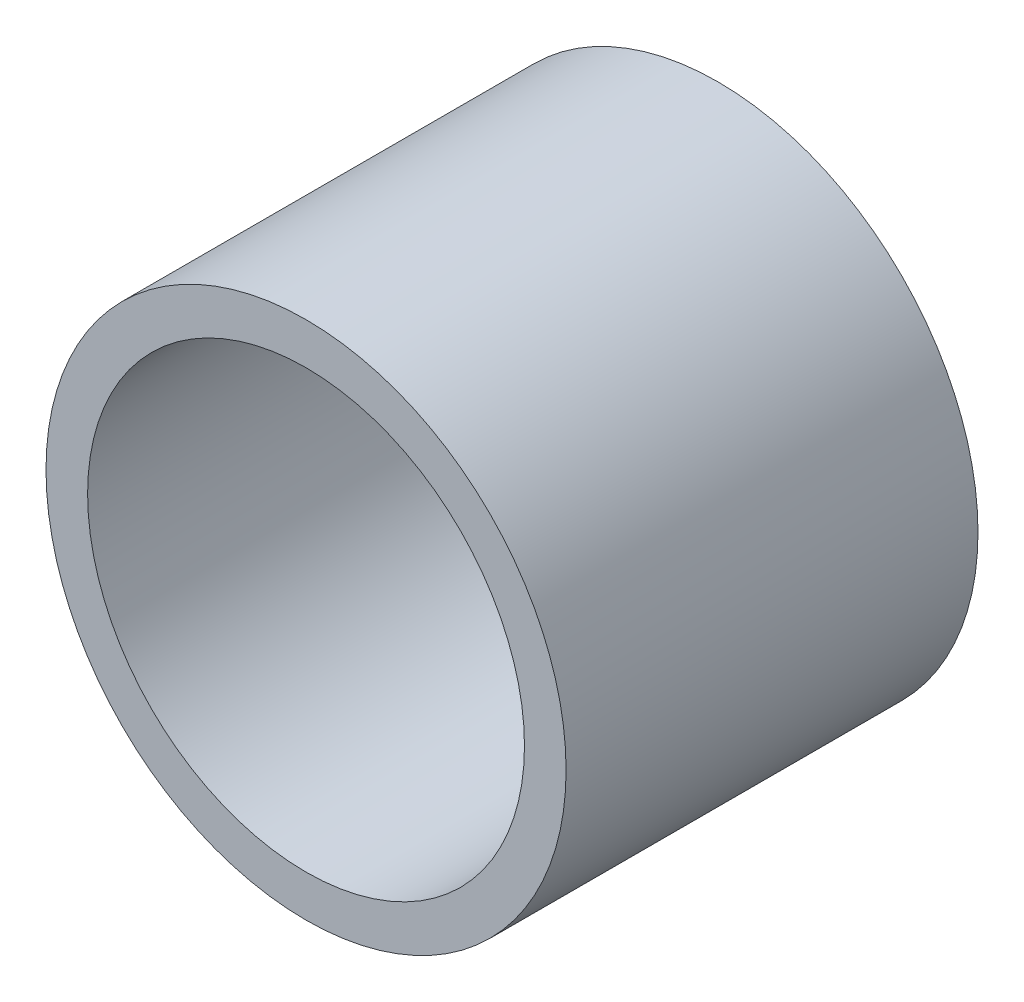
ISO-10303-21;
HEADER;
FILE_DESCRIPTION(('STEP AP214'),'2;1');
FILE_NAME('part.step','',(''),(''),'','','');
FILE_SCHEMA(('AUTOMOTIVE_DESIGN { 1 0 10303 214 1 1 1 1 }'));
ENDSEC;
DATA;
#1=APPLICATION_CONTEXT('core data for automotive mechanical design processes');
#2=APPLICATION_PROTOCOL_DEFINITION('international standard','automotive_design',2000,#1);
#3=PRODUCT_CONTEXT('',#1,'mechanical');
#4=PRODUCT('Part','Part','',(#3));
#5=PRODUCT_RELATED_PRODUCT_CATEGORY('part','',(#4));
#6=PRODUCT_DEFINITION_FORMATION('','',#4);
#7=PRODUCT_DEFINITION_CONTEXT('part definition',#1,'design');
#8=PRODUCT_DEFINITION('design','',#6,#7);
#9=PRODUCT_DEFINITION_SHAPE('','',#8);
#10=(LENGTH_UNIT() NAMED_UNIT(*) SI_UNIT(.MILLI.,.METRE.));
#11=(NAMED_UNIT(*) PLANE_ANGLE_UNIT() SI_UNIT($,.RADIAN.));
#12=(NAMED_UNIT(*) SI_UNIT($,.STERADIAN.) SOLID_ANGLE_UNIT());
#13=UNCERTAINTY_MEASURE_WITH_UNIT(LENGTH_MEASURE(1.E-05),#10,'distance_accuracy_value','');
#14=(GEOMETRIC_REPRESENTATION_CONTEXT(3) GLOBAL_UNCERTAINTY_ASSIGNED_CONTEXT((#13)) GLOBAL_UNIT_ASSIGNED_CONTEXT((#10,
#11,#12)) REPRESENTATION_CONTEXT('',''));
#15=CARTESIAN_POINT('',(0.,0.,0.));
#16=DIRECTION('',(0.,0.,1.));
#17=DIRECTION('',(1.,0.,0.));
#18=AXIS2_PLACEMENT_3D('',#15,#16,#17);
#19=CARTESIAN_POINT('',(0.,0.,19.8));
#20=DIRECTION('',(0.,0.,1.));
#21=DIRECTION('',(1.,0.,0.));
#22=AXIS2_PLACEMENT_3D('',#19,#20,#21);
#23=PLANE('',#22);
#24=CARTESIAN_POINT('',(0.,0.,19.8));
#25=DIRECTION('',(0.,0.,1.));
#26=DIRECTION('',(1.,0.,0.));
#27=AXIS2_PLACEMENT_3D('',#24,#25,#26);
#28=CIRCLE('',#27,12.5);
#29=CARTESIAN_POINT('',(-12.5,0.,19.8));
#30=VERTEX_POINT('',#29);
#31=EDGE_CURVE('E10',#30,#30,#28,.T.);
#32=ORIENTED_EDGE('',*,*,#31,.T.);
#33=EDGE_LOOP('',(#32));
#34=FACE_BOUND('',#33,.T.);
#35=CARTESIAN_POINT('',(0.,0.,19.8));
#36=DIRECTION('',(0.,0.,1.));
#37=DIRECTION('',(1.,0.,0.));
#38=AXIS2_PLACEMENT_3D('',#35,#36,#37);
#39=CIRCLE('',#38,10.5);
#40=CARTESIAN_POINT('',(-10.5,0.,19.8));
#41=VERTEX_POINT('',#40);
#42=EDGE_CURVE('E50',#41,#41,#39,.T.);
#43=ORIENTED_EDGE('',*,*,#42,.F.);
#44=EDGE_LOOP('',(#43));
#45=FACE_BOUND('',#44,.T.);
#46=ADVANCED_FACE('F37',(#34,#45),#23,.T.);
#47=CARTESIAN_POINT('',(0.,0.,0.));
#48=DIRECTION('',(0.,0.,1.));
#49=DIRECTION('',(1.,0.,0.));
#50=AXIS2_PLACEMENT_3D('',#47,#48,#49);
#51=PLANE('',#50);
#52=CARTESIAN_POINT('',(0.,0.,0.));
#53=DIRECTION('',(0.,0.,1.));
#54=DIRECTION('',(1.,0.,0.));
#55=AXIS2_PLACEMENT_3D('',#52,#53,#54);
#56=CIRCLE('',#55,12.5);
#57=CARTESIAN_POINT('',(-12.5,0.,0.));
#58=VERTEX_POINT('',#57);
#59=EDGE_CURVE('E41',#58,#58,#56,.T.);
#60=ORIENTED_EDGE('',*,*,#59,.F.);
#61=EDGE_LOOP('',(#60));
#62=FACE_BOUND('',#61,.T.);
#63=CARTESIAN_POINT('',(0.,0.,0.));
#64=DIRECTION('',(0.,0.,1.));
#65=DIRECTION('',(1.,0.,0.));
#66=AXIS2_PLACEMENT_3D('',#63,#64,#65);
#67=CIRCLE('',#66,10.5);
#68=CARTESIAN_POINT('',(-10.5,0.,0.));
#69=VERTEX_POINT('',#68);
#70=EDGE_CURVE('E52',#69,#69,#67,.T.);
#71=ORIENTED_EDGE('',*,*,#70,.T.);
#72=EDGE_LOOP('',(#71));
#73=FACE_BOUND('',#72,.T.);
#74=ADVANCED_FACE('F64',(#62,#73),#51,.F.);
#75=CARTESIAN_POINT('',(0.,0.,19.8));
#76=DIRECTION('',(0.,0.,-1.));
#77=DIRECTION('',(-1.,0.,0.));
#78=AXIS2_PLACEMENT_3D('',#75,#76,#77);
#79=CYLINDRICAL_SURFACE('',#78,12.5);
#80=CARTESIAN_POINT('',(-12.5,0.,19.8));
#81=CARTESIAN_POINT('',(-12.5,0.,19.59375));
#82=CARTESIAN_POINT('',(-12.5,0.,19.3875));
#83=CARTESIAN_POINT('',(-12.5,0.,18.975));
#84=CARTESIAN_POINT('',(-12.5,0.,18.76875));
#85=CARTESIAN_POINT('',(-12.5,0.,18.35625));
#86=CARTESIAN_POINT('',(-12.5,0.,18.15));
#87=CARTESIAN_POINT('',(-12.5,0.,17.7375));
#88=CARTESIAN_POINT('',(-12.5,0.,17.53125));
#89=CARTESIAN_POINT('',(-12.5,0.,17.11875));
#90=CARTESIAN_POINT('',(-12.5,0.,16.9125));
#91=CARTESIAN_POINT('',(-12.5,0.,16.5));
#92=CARTESIAN_POINT('',(-12.5,0.,16.29375));
#93=CARTESIAN_POINT('',(-12.5,0.,15.88125));
#94=CARTESIAN_POINT('',(-12.5,0.,15.675));
#95=CARTESIAN_POINT('',(-12.5,0.,15.2625));
#96=CARTESIAN_POINT('',(-12.5,0.,15.05625));
#97=CARTESIAN_POINT('',(-12.5,0.,14.64375));
#98=CARTESIAN_POINT('',(-12.5,0.,14.4375));
#99=CARTESIAN_POINT('',(-12.5,0.,14.025));
#100=CARTESIAN_POINT('',(-12.5,0.,13.81875));
#101=CARTESIAN_POINT('',(-12.5,0.,13.40625));
#102=CARTESIAN_POINT('',(-12.5,0.,13.2));
#103=CARTESIAN_POINT('',(-12.5,0.,12.7875));
#104=CARTESIAN_POINT('',(-12.5,0.,12.58125));
#105=CARTESIAN_POINT('',(-12.5,0.,12.16875));
#106=CARTESIAN_POINT('',(-12.5,0.,11.9625));
#107=CARTESIAN_POINT('',(-12.5,0.,11.55));
#108=CARTESIAN_POINT('',(-12.5,0.,11.34375));
#109=CARTESIAN_POINT('',(-12.5,0.,10.93125));
#110=CARTESIAN_POINT('',(-12.5,0.,10.725));
#111=CARTESIAN_POINT('',(-12.5,0.,10.3125));
#112=CARTESIAN_POINT('',(-12.5,0.,10.10625));
#113=CARTESIAN_POINT('',(-12.5,0.,9.69375));
#114=CARTESIAN_POINT('',(-12.5,0.,9.4875));
#115=CARTESIAN_POINT('',(-12.5,0.,9.075));
#116=CARTESIAN_POINT('',(-12.5,0.,8.86875));
#117=CARTESIAN_POINT('',(-12.5,0.,8.45625));
#118=CARTESIAN_POINT('',(-12.5,0.,8.25));
#119=CARTESIAN_POINT('',(-12.5,0.,7.8375));
#120=CARTESIAN_POINT('',(-12.5,0.,7.63125));
#121=CARTESIAN_POINT('',(-12.5,0.,7.21875));
#122=CARTESIAN_POINT('',(-12.5,0.,7.0125));
#123=CARTESIAN_POINT('',(-12.5,0.,6.6));
#124=CARTESIAN_POINT('',(-12.5,0.,6.39375));
#125=CARTESIAN_POINT('',(-12.5,0.,5.98125));
#126=CARTESIAN_POINT('',(-12.5,0.,5.775));
#127=CARTESIAN_POINT('',(-12.5,0.,5.3625));
#128=CARTESIAN_POINT('',(-12.5,0.,5.15625));
#129=CARTESIAN_POINT('',(-12.5,0.,4.74375));
#130=CARTESIAN_POINT('',(-12.5,0.,4.5375));
#131=CARTESIAN_POINT('',(-12.5,0.,4.125));
#132=CARTESIAN_POINT('',(-12.5,0.,3.91875));
#133=CARTESIAN_POINT('',(-12.5,0.,3.50625));
#134=CARTESIAN_POINT('',(-12.5,0.,3.3));
#135=CARTESIAN_POINT('',(-12.5,0.,2.8875));
#136=CARTESIAN_POINT('',(-12.5,0.,2.68125));
#137=CARTESIAN_POINT('',(-12.5,0.,2.26875));
#138=CARTESIAN_POINT('',(-12.5,0.,2.0625));
#139=CARTESIAN_POINT('',(-12.5,0.,1.65));
#140=CARTESIAN_POINT('',(-12.5,0.,1.44375));
#141=CARTESIAN_POINT('',(-12.5,0.,1.03125));
#142=CARTESIAN_POINT('',(-12.5,0.,0.825));
#143=CARTESIAN_POINT('',(-12.5,0.,0.412500000000001));
#144=CARTESIAN_POINT('',(-12.5,0.,0.206250000000001));
#145=CARTESIAN_POINT('',(-12.5,0.,0.));
#146=B_SPLINE_CURVE_WITH_KNOTS('',3,(#80,#81,#82,#83,#84,#85,#86,#87,#88,#89,#90,#91,#92,#93,
#94,#95,#96,#97,#98,#99,#100,#101,#102,#103,#104,#105,#106,#107,#108,#109,#110,#111,#112,#113,
#114,#115,#116,#117,#118,#119,#120,#121,#122,#123,#124,#125,#126,#127,#128,#129,#130,#131,#132,
#133,#134,#135,#136,#137,#138,#139,#140,#141,#142,#143,#144,#145),.UNSPECIFIED.,.F.,.F.,(4,2,2,
2,2,2,2,2,2,2,2,2,2,2,2,2,2,2,2,2,2,2,2,2,2,2,2,2,2,2,2,2,4),(0.,0.618750000000001,1.2375,
1.85625,2.475,3.09375,3.7125,4.33125,4.95,5.56875,6.1875,6.80625,7.425,8.04375,8.6625,9.28125,
9.9,10.51875,11.1375,11.75625,12.375,12.99375,13.6125,14.23125,14.85,15.46875,16.0875,16.70625,
17.325,17.94375,18.5625,19.18125,19.8),.UNSPECIFIED.);
#147=EDGE_CURVE('BSEAM39',#30,#58,#146,.T.);
#148=ORIENTED_EDGE('',*,*,#31,.F.);
#149=ORIENTED_EDGE('',*,*,#59,.T.);
#150=ORIENTED_EDGE('',*,*,#147,.T.);
#151=ORIENTED_EDGE('',*,*,#147,.F.);
#152=EDGE_LOOP('',(#148,#150,#149,#151));
#153=FACE_BOUND('',#152,.T.);
#154=ADVANCED_FACE('F39',(#153),#79,.T.);
#155=CARTESIAN_POINT('',(0.,0.,19.8));
#156=DIRECTION('',(0.,0.,-1.));
#157=DIRECTION('',(-1.,0.,0.));
#158=AXIS2_PLACEMENT_3D('',#155,#156,#157);
#159=CYLINDRICAL_SURFACE('',#158,10.5);
#160=CARTESIAN_POINT('',(-10.5,0.,19.8));
#161=CARTESIAN_POINT('',(-10.5,0.,19.59375));
#162=CARTESIAN_POINT('',(-10.5,0.,19.3875));
#163=CARTESIAN_POINT('',(-10.5,0.,18.975));
#164=CARTESIAN_POINT('',(-10.5,0.,18.76875));
#165=CARTESIAN_POINT('',(-10.5,0.,18.35625));
#166=CARTESIAN_POINT('',(-10.5,0.,18.15));
#167=CARTESIAN_POINT('',(-10.5,0.,17.7375));
#168=CARTESIAN_POINT('',(-10.5,0.,17.53125));
#169=CARTESIAN_POINT('',(-10.5,0.,17.11875));
#170=CARTESIAN_POINT('',(-10.5,0.,16.9125));
#171=CARTESIAN_POINT('',(-10.5,0.,16.5));
#172=CARTESIAN_POINT('',(-10.5,0.,16.29375));
#173=CARTESIAN_POINT('',(-10.5,0.,15.88125));
#174=CARTESIAN_POINT('',(-10.5,0.,15.675));
#175=CARTESIAN_POINT('',(-10.5,0.,15.2625));
#176=CARTESIAN_POINT('',(-10.5,0.,15.05625));
#177=CARTESIAN_POINT('',(-10.5,0.,14.64375));
#178=CARTESIAN_POINT('',(-10.5,0.,14.4375));
#179=CARTESIAN_POINT('',(-10.5,0.,14.025));
#180=CARTESIAN_POINT('',(-10.5,0.,13.81875));
#181=CARTESIAN_POINT('',(-10.5,0.,13.40625));
#182=CARTESIAN_POINT('',(-10.5,0.,13.2));
#183=CARTESIAN_POINT('',(-10.5,0.,12.7875));
#184=CARTESIAN_POINT('',(-10.5,0.,12.58125));
#185=CARTESIAN_POINT('',(-10.5,0.,12.16875));
#186=CARTESIAN_POINT('',(-10.5,0.,11.9625));
#187=CARTESIAN_POINT('',(-10.5,0.,11.55));
#188=CARTESIAN_POINT('',(-10.5,0.,11.34375));
#189=CARTESIAN_POINT('',(-10.5,0.,10.93125));
#190=CARTESIAN_POINT('',(-10.5,0.,10.725));
#191=CARTESIAN_POINT('',(-10.5,0.,10.3125));
#192=CARTESIAN_POINT('',(-10.5,0.,10.10625));
#193=CARTESIAN_POINT('',(-10.5,0.,9.69375));
#194=CARTESIAN_POINT('',(-10.5,0.,9.4875));
#195=CARTESIAN_POINT('',(-10.5,0.,9.075));
#196=CARTESIAN_POINT('',(-10.5,0.,8.86875));
#197=CARTESIAN_POINT('',(-10.5,0.,8.45625));
#198=CARTESIAN_POINT('',(-10.5,0.,8.25));
#199=CARTESIAN_POINT('',(-10.5,0.,7.8375));
#200=CARTESIAN_POINT('',(-10.5,0.,7.63125));
#201=CARTESIAN_POINT('',(-10.5,0.,7.21875));
#202=CARTESIAN_POINT('',(-10.5,0.,7.0125));
#203=CARTESIAN_POINT('',(-10.5,0.,6.6));
#204=CARTESIAN_POINT('',(-10.5,0.,6.39375));
#205=CARTESIAN_POINT('',(-10.5,0.,5.98125));
#206=CARTESIAN_POINT('',(-10.5,0.,5.775));
#207=CARTESIAN_POINT('',(-10.5,0.,5.3625));
#208=CARTESIAN_POINT('',(-10.5,0.,5.15625));
#209=CARTESIAN_POINT('',(-10.5,0.,4.74375));
#210=CARTESIAN_POINT('',(-10.5,0.,4.5375));
#211=CARTESIAN_POINT('',(-10.5,0.,4.125));
#212=CARTESIAN_POINT('',(-10.5,0.,3.91875));
#213=CARTESIAN_POINT('',(-10.5,0.,3.50625));
#214=CARTESIAN_POINT('',(-10.5,0.,3.3));
#215=CARTESIAN_POINT('',(-10.5,0.,2.8875));
#216=CARTESIAN_POINT('',(-10.5,0.,2.68125));
#217=CARTESIAN_POINT('',(-10.5,0.,2.26875));
#218=CARTESIAN_POINT('',(-10.5,0.,2.0625));
#219=CARTESIAN_POINT('',(-10.5,0.,1.65));
#220=CARTESIAN_POINT('',(-10.5,0.,1.44375));
#221=CARTESIAN_POINT('',(-10.5,0.,1.03125));
#222=CARTESIAN_POINT('',(-10.5,0.,0.825));
#223=CARTESIAN_POINT('',(-10.5,0.,0.412500000000001));
#224=CARTESIAN_POINT('',(-10.5,0.,0.206250000000001));
#225=CARTESIAN_POINT('',(-10.5,0.,0.));
#226=B_SPLINE_CURVE_WITH_KNOTS('',3,(#160,#161,#162,#163,#164,#165,#166,#167,#168,#169,#170,
#171,#172,#173,#174,#175,#176,#177,#178,#179,#180,#181,#182,#183,#184,#185,#186,#187,#188,#189,
#190,#191,#192,#193,#194,#195,#196,#197,#198,#199,#200,#201,#202,#203,#204,#205,#206,#207,#208,
#209,#210,#211,#212,#213,#214,#215,#216,#217,#218,#219,#220,#221,#222,#223,#224,#225),
.UNSPECIFIED.,.F.,.F.,(4,2,2,2,2,2,2,2,2,2,2,2,2,2,2,2,2,2,2,2,2,2,2,2,2,2,2,2,2,2,2,2,4),(0.,
0.618750000000001,1.2375,1.85625,2.475,3.09375,3.7125,4.33125,4.95,5.56875,6.1875,6.80625,7.425,
8.04375,8.6625,9.28125,9.9,10.51875,11.1375,11.75625,12.375,12.99375,13.6125,14.23125,14.85,
15.46875,16.0875,16.70625,17.325,17.94375,18.5625,19.18125,19.8),.UNSPECIFIED.);
#227=EDGE_CURVE('BSEAM60',#41,#69,#226,.T.);
#228=ORIENTED_EDGE('',*,*,#42,.T.);
#229=ORIENTED_EDGE('',*,*,#70,.F.);
#230=ORIENTED_EDGE('',*,*,#227,.T.);
#231=ORIENTED_EDGE('',*,*,#227,.F.);
#232=EDGE_LOOP('',(#228,#230,#229,#231));
#233=FACE_BOUND('',#232,.T.);
#234=ADVANCED_FACE('F60',(#233),#159,.F.);
#235=CLOSED_SHELL('',(#46,#74,#154,#234));
#236=MANIFOLD_SOLID_BREP('B2',#235);
#237=ADVANCED_BREP_SHAPE_REPRESENTATION('',(#18,#236),#14);
#238=SHAPE_DEFINITION_REPRESENTATION(#9,#237);
ENDSEC;
END-ISO-10303-21;
